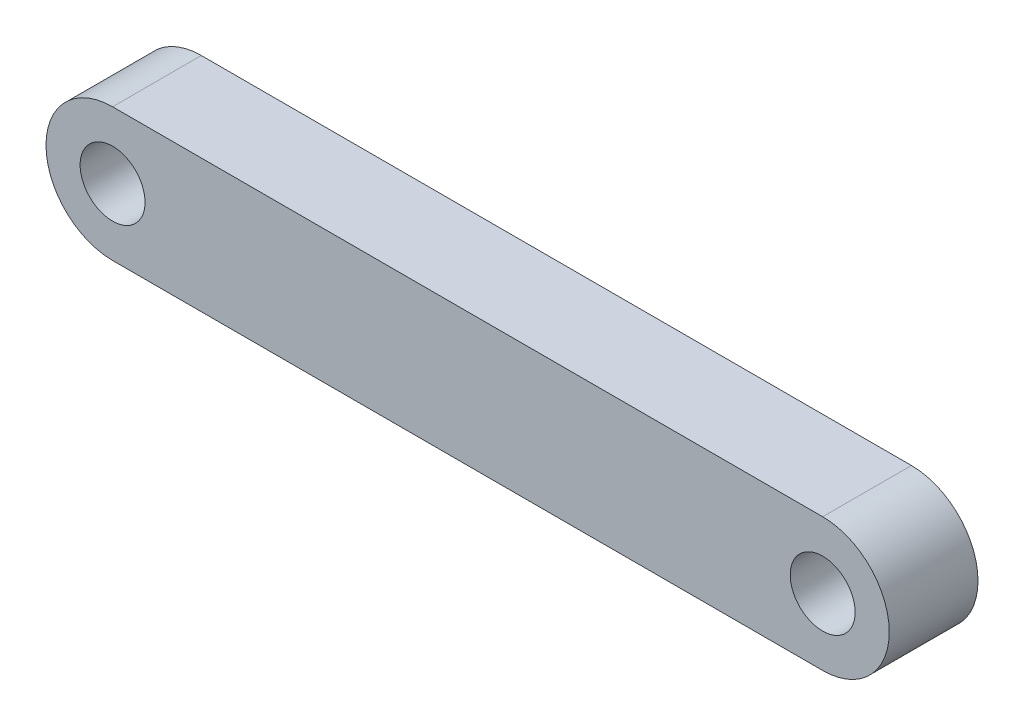
ISO-10303-21;
HEADER;
FILE_DESCRIPTION(('STEP AP214'),'2;1');
FILE_NAME('part.step','',(''),(''),'','','');
FILE_SCHEMA(('AUTOMOTIVE_DESIGN { 1 0 10303 214 1 1 1 1 }'));
ENDSEC;
DATA;
#1=APPLICATION_CONTEXT('core data for automotive mechanical design processes');
#2=APPLICATION_PROTOCOL_DEFINITION('international standard','automotive_design',2000,#1);
#3=PRODUCT_CONTEXT('',#1,'mechanical');
#4=PRODUCT('Part','Part','',(#3));
#5=PRODUCT_RELATED_PRODUCT_CATEGORY('part','',(#4));
#6=PRODUCT_DEFINITION_FORMATION('','',#4);
#7=PRODUCT_DEFINITION_CONTEXT('part definition',#1,'design');
#8=PRODUCT_DEFINITION('design','',#6,#7);
#9=PRODUCT_DEFINITION_SHAPE('','',#8);
#10=(LENGTH_UNIT() NAMED_UNIT(*) SI_UNIT(.MILLI.,.METRE.));
#11=(NAMED_UNIT(*) PLANE_ANGLE_UNIT() SI_UNIT($,.RADIAN.));
#12=(NAMED_UNIT(*) SI_UNIT($,.STERADIAN.) SOLID_ANGLE_UNIT());
#13=UNCERTAINTY_MEASURE_WITH_UNIT(LENGTH_MEASURE(1.E-05),#10,'distance_accuracy_value','');
#14=(GEOMETRIC_REPRESENTATION_CONTEXT(3) GLOBAL_UNCERTAINTY_ASSIGNED_CONTEXT((#13)) GLOBAL_UNIT_ASSIGNED_CONTEXT((#10,
#11,#12)) REPRESENTATION_CONTEXT('',''));
#15=CARTESIAN_POINT('',(0.,0.,0.));
#16=DIRECTION('',(0.,0.,1.));
#17=DIRECTION('',(1.,0.,0.));
#18=AXIS2_PLACEMENT_3D('',#15,#16,#17);
#19=CARTESIAN_POINT('',(0.,0.,10.));
#20=DIRECTION('',(0.,0.,1.));
#21=DIRECTION('',(1.,0.,0.));
#22=AXIS2_PLACEMENT_3D('',#19,#20,#21);
#23=PLANE('',#22);
#24=CARTESIAN_POINT('',(0.,0.,10.));
#25=DIRECTION('',(0.,0.,1.));
#26=DIRECTION('',(1.,0.,0.));
#27=AXIS2_PLACEMENT_3D('',#24,#25,#26);
#28=CIRCLE('',#27,3.6576);
#29=CARTESIAN_POINT('',(3.6576,0.,10.));
#30=VERTEX_POINT('',#29);
#31=EDGE_CURVE('E112',#30,#30,#28,.T.);
#32=ORIENTED_EDGE('',*,*,#31,.F.);
#33=EDGE_LOOP('',(#32));
#34=FACE_BOUND('',#33,.T.);
#35=CARTESIAN_POINT('',(0.,0.,10.));
#36=DIRECTION('',(0.,0.,1.));
#37=DIRECTION('',(1.,0.,0.));
#38=AXIS2_PLACEMENT_3D('',#35,#36,#37);
#39=CIRCLE('',#38,7.5);
#40=CARTESIAN_POINT('',(0.,7.5,10.));
#41=VERTEX_POINT('',#40);
#42=CARTESIAN_POINT('',(0.,-7.5,10.));
#43=VERTEX_POINT('',#42);
#44=EDGE_CURVE('E92',#41,#43,#39,.T.);
#45=ORIENTED_EDGE('',*,*,#44,.T.);
#46=DIRECTION('',(1.,0.,0.));
#47=VECTOR('',#46,1.);
#48=CARTESIAN_POINT('',(0.,-7.5,10.));
#49=LINE('',#48,#47);
#50=CARTESIAN_POINT('',(80.,-7.5,10.));
#51=VERTEX_POINT('',#50);
#52=EDGE_CURVE('E87',#43,#51,#49,.T.);
#53=ORIENTED_EDGE('',*,*,#52,.T.);
#54=CARTESIAN_POINT('',(80.,0.,10.));
#55=DIRECTION('',(0.,0.,1.));
#56=DIRECTION('',(1.,0.,0.));
#57=AXIS2_PLACEMENT_3D('',#54,#55,#56);
#58=CIRCLE('',#57,7.5);
#59=CARTESIAN_POINT('',(80.,7.5,10.));
#60=VERTEX_POINT('',#59);
#61=EDGE_CURVE('E90',#51,#60,#58,.T.);
#62=ORIENTED_EDGE('',*,*,#61,.T.);
#63=DIRECTION('',(-1.,0.,0.));
#64=VECTOR('',#63,1.);
#65=CARTESIAN_POINT('',(0.,7.5,10.));
#66=LINE('',#65,#64);
#67=EDGE_CURVE('E57',#60,#41,#66,.T.);
#68=ORIENTED_EDGE('',*,*,#67,.T.);
#69=EDGE_LOOP('',(#45,#53,#62,#68));
#70=FACE_BOUND('',#69,.T.);
#71=CARTESIAN_POINT('',(80.,0.,10.));
#72=DIRECTION('',(0.,0.,1.));
#73=DIRECTION('',(1.,0.,0.));
#74=AXIS2_PLACEMENT_3D('',#71,#72,#73);
#75=CIRCLE('',#74,3.6576);
#76=CARTESIAN_POINT('',(83.6576,0.,10.));
#77=VERTEX_POINT('',#76);
#78=EDGE_CURVE('E134',#77,#77,#75,.T.);
#79=ORIENTED_EDGE('',*,*,#78,.F.);
#80=EDGE_LOOP('',(#79));
#81=FACE_BOUND('',#80,.T.);
#82=ADVANCED_FACE('F39',(#34,#70,#81),#23,.T.);
#83=CARTESIAN_POINT('',(0.,0.,0.));
#84=DIRECTION('',(0.,0.,1.));
#85=DIRECTION('',(1.,0.,0.));
#86=AXIS2_PLACEMENT_3D('',#83,#84,#85);
#87=PLANE('',#86);
#88=CARTESIAN_POINT('',(0.,0.,0.));
#89=DIRECTION('',(0.,0.,1.));
#90=DIRECTION('',(1.,0.,0.));
#91=AXIS2_PLACEMENT_3D('',#88,#89,#90);
#92=CIRCLE('',#91,7.5);
#93=CARTESIAN_POINT('',(0.,7.5,0.));
#94=VERTEX_POINT('',#93);
#95=CARTESIAN_POINT('',(0.,-7.5,0.));
#96=VERTEX_POINT('',#95);
#97=EDGE_CURVE('E108',#94,#96,#92,.T.);
#98=ORIENTED_EDGE('',*,*,#97,.F.);
#99=DIRECTION('',(-1.,0.,0.));
#100=VECTOR('',#99,1.);
#101=CARTESIAN_POINT('',(0.,7.5,0.));
#102=LINE('',#101,#100);
#103=CARTESIAN_POINT('',(80.,7.5,0.));
#104=VERTEX_POINT('',#103);
#105=EDGE_CURVE('E80',#104,#94,#102,.T.);
#106=ORIENTED_EDGE('',*,*,#105,.F.);
#107=CARTESIAN_POINT('',(80.,0.,0.));
#108=DIRECTION('',(0.,0.,1.));
#109=DIRECTION('',(1.,0.,0.));
#110=AXIS2_PLACEMENT_3D('',#107,#108,#109);
#111=CIRCLE('',#110,7.5);
#112=CARTESIAN_POINT('',(80.,-7.5,0.));
#113=VERTEX_POINT('',#112);
#114=EDGE_CURVE('E74',#113,#104,#111,.T.);
#115=ORIENTED_EDGE('',*,*,#114,.F.);
#116=DIRECTION('',(1.,0.,0.));
#117=VECTOR('',#116,1.);
#118=CARTESIAN_POINT('',(0.,-7.5,0.));
#119=LINE('',#118,#117);
#120=EDGE_CURVE('E97',#96,#113,#119,.T.);
#121=ORIENTED_EDGE('',*,*,#120,.F.);
#122=EDGE_LOOP('',(#98,#106,#115,#121));
#123=FACE_BOUND('',#122,.T.);
#124=CARTESIAN_POINT('',(0.,0.,0.));
#125=DIRECTION('',(0.,0.,1.));
#126=DIRECTION('',(1.,0.,0.));
#127=AXIS2_PLACEMENT_3D('',#124,#125,#126);
#128=CIRCLE('',#127,3.6576);
#129=CARTESIAN_POINT('',(3.6576,0.,0.));
#130=VERTEX_POINT('',#129);
#131=EDGE_CURVE('E130',#130,#130,#128,.T.);
#132=ORIENTED_EDGE('',*,*,#131,.T.);
#133=EDGE_LOOP('',(#132));
#134=FACE_BOUND('',#133,.T.);
#135=CARTESIAN_POINT('',(80.,0.,0.));
#136=DIRECTION('',(0.,0.,1.));
#137=DIRECTION('',(1.,0.,0.));
#138=AXIS2_PLACEMENT_3D('',#135,#136,#137);
#139=CIRCLE('',#138,3.6576);
#140=CARTESIAN_POINT('',(83.6576,0.,0.));
#141=VERTEX_POINT('',#140);
#142=EDGE_CURVE('E138',#141,#141,#139,.T.);
#143=ORIENTED_EDGE('',*,*,#142,.T.);
#144=EDGE_LOOP('',(#143));
#145=FACE_BOUND('',#144,.T.);
#146=ADVANCED_FACE('F125',(#123,#134,#145),#87,.F.);
#147=CARTESIAN_POINT('',(0.,0.,10.));
#148=DIRECTION('',(0.,0.,-1.));
#149=DIRECTION('',(-1.,0.,0.));
#150=AXIS2_PLACEMENT_3D('',#147,#148,#149);
#151=CYLINDRICAL_SURFACE('',#150,7.5);
#152=ORIENTED_EDGE('',*,*,#97,.T.);
#153=DIRECTION('',(0.,0.,-1.));
#154=VECTOR('',#153,1.);
#155=CARTESIAN_POINT('',(0.,-7.5,10.));
#156=LINE('',#155,#154);
#157=EDGE_CURVE('E11',#43,#96,#156,.T.);
#158=ORIENTED_EDGE('',*,*,#157,.F.);
#159=ORIENTED_EDGE('',*,*,#44,.F.);
#160=DIRECTION('',(0.,0.,-1.));
#161=VECTOR('',#160,1.);
#162=CARTESIAN_POINT('',(0.,7.5,10.));
#163=LINE('',#162,#161);
#164=EDGE_CURVE('E104',#41,#94,#163,.T.);
#165=ORIENTED_EDGE('',*,*,#164,.T.);
#166=EDGE_LOOP('',(#152,#158,#159,#165));
#167=FACE_BOUND('',#166,.T.);
#168=ADVANCED_FACE('F41',(#167),#151,.T.);
#169=CARTESIAN_POINT('',(0.,-7.5,10.));
#170=DIRECTION('',(0.,1.,0.));
#171=DIRECTION('',(0.,0.,1.));
#172=AXIS2_PLACEMENT_3D('',#169,#170,#171);
#173=PLANE('',#172);
#174=ORIENTED_EDGE('',*,*,#120,.T.);
#175=DIRECTION('',(0.,0.,-1.));
#176=VECTOR('',#175,1.);
#177=CARTESIAN_POINT('',(80.,-7.5,10.));
#178=LINE('',#177,#176);
#179=EDGE_CURVE('E49',#51,#113,#178,.T.);
#180=ORIENTED_EDGE('',*,*,#179,.F.);
#181=ORIENTED_EDGE('',*,*,#52,.F.);
#182=ORIENTED_EDGE('',*,*,#157,.T.);
#183=EDGE_LOOP('',(#174,#180,#181,#182));
#184=FACE_BOUND('',#183,.T.);
#185=ADVANCED_FACE('F96',(#184),#173,.F.);
#186=CARTESIAN_POINT('',(80.,0.,10.));
#187=DIRECTION('',(0.,0.,-1.));
#188=DIRECTION('',(-1.,0.,0.));
#189=AXIS2_PLACEMENT_3D('',#186,#187,#188);
#190=CYLINDRICAL_SURFACE('',#189,7.5);
#191=ORIENTED_EDGE('',*,*,#114,.T.);
#192=DIRECTION('',(0.,0.,-1.));
#193=VECTOR('',#192,1.);
#194=CARTESIAN_POINT('',(80.,7.5,10.));
#195=LINE('',#194,#193);
#196=EDGE_CURVE('E99',#60,#104,#195,.T.);
#197=ORIENTED_EDGE('',*,*,#196,.F.);
#198=ORIENTED_EDGE('',*,*,#61,.F.);
#199=ORIENTED_EDGE('',*,*,#179,.T.);
#200=EDGE_LOOP('',(#191,#197,#198,#199));
#201=FACE_BOUND('',#200,.T.);
#202=ADVANCED_FACE('F100',(#201),#190,.T.);
#203=CARTESIAN_POINT('',(0.,7.5,10.));
#204=DIRECTION('',(0.,-1.,0.));
#205=DIRECTION('',(0.,0.,-1.));
#206=AXIS2_PLACEMENT_3D('',#203,#204,#205);
#207=PLANE('',#206);
#208=ORIENTED_EDGE('',*,*,#105,.T.);
#209=ORIENTED_EDGE('',*,*,#164,.F.);
#210=ORIENTED_EDGE('',*,*,#67,.F.);
#211=ORIENTED_EDGE('',*,*,#196,.T.);
#212=EDGE_LOOP('',(#208,#209,#210,#211));
#213=FACE_BOUND('',#212,.T.);
#214=ADVANCED_FACE('F122',(#213),#207,.F.);
#215=CARTESIAN_POINT('',(0.,0.,10.));
#216=DIRECTION('',(0.,0.,-1.));
#217=DIRECTION('',(-1.,0.,0.));
#218=AXIS2_PLACEMENT_3D('',#215,#216,#217);
#219=CYLINDRICAL_SURFACE('',#218,3.6576);
#220=ORIENTED_EDGE('',*,*,#31,.T.);
#221=EDGE_LOOP('',(#220));
#222=FACE_BOUND('',#221,.T.);
#223=ORIENTED_EDGE('',*,*,#131,.F.);
#224=EDGE_LOOP('',(#223));
#225=FACE_BOUND('',#224,.T.);
#226=ADVANCED_FACE('F157',(#222,#225),#219,.F.);
#227=CARTESIAN_POINT('',(80.,0.,10.));
#228=DIRECTION('',(0.,0.,-1.));
#229=DIRECTION('',(-1.,0.,0.));
#230=AXIS2_PLACEMENT_3D('',#227,#228,#229);
#231=CYLINDRICAL_SURFACE('',#230,3.6576);
#232=ORIENTED_EDGE('',*,*,#78,.T.);
#233=EDGE_LOOP('',(#232));
#234=FACE_BOUND('',#233,.T.);
#235=ORIENTED_EDGE('',*,*,#142,.F.);
#236=EDGE_LOOP('',(#235));
#237=FACE_BOUND('',#236,.T.);
#238=ADVANCED_FACE('F146',(#234,#237),#231,.F.);
#239=CLOSED_SHELL('',(#82,#146,#168,#185,#202,#214,#226,#238));
#240=MANIFOLD_SOLID_BREP('B2',#239);
#241=ADVANCED_BREP_SHAPE_REPRESENTATION('',(#18,#240),#14);
#242=SHAPE_DEFINITION_REPRESENTATION(#9,#241);
ENDSEC;
END-ISO-10303-21;
